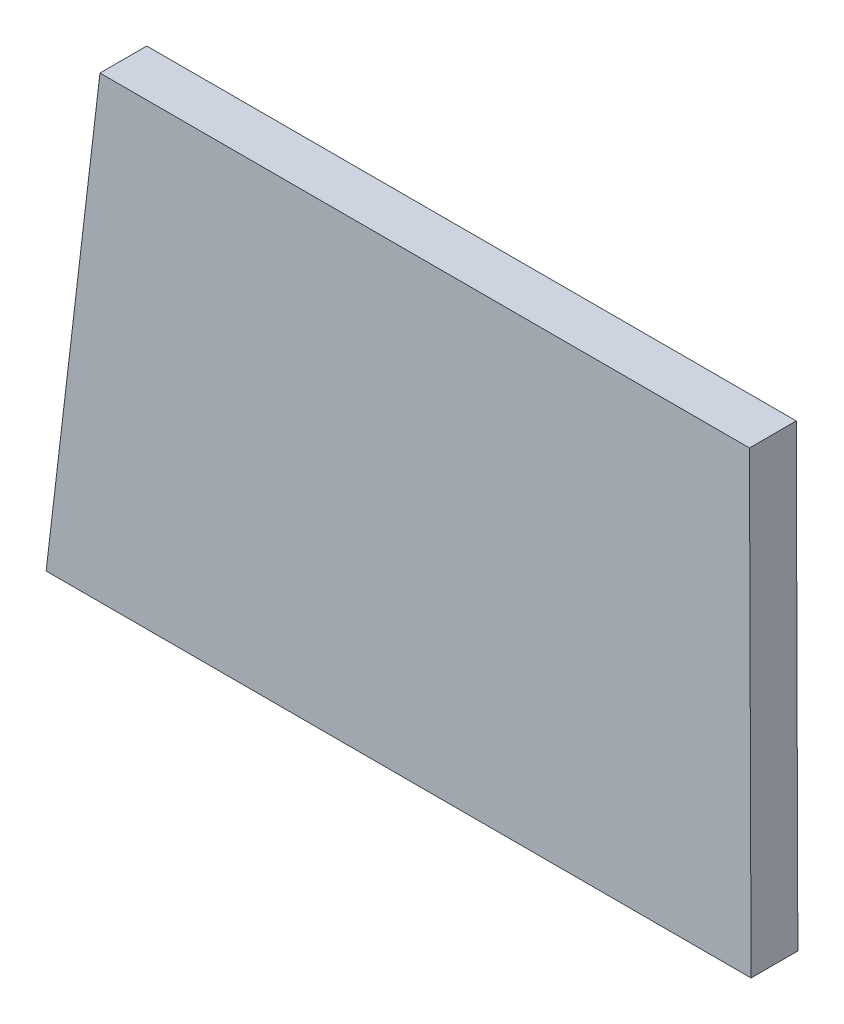
ISO-10303-21;
HEADER;
FILE_DESCRIPTION(('STEP AP214'),'2;1');
FILE_NAME('part.step','',(''),(''),'','','');
FILE_SCHEMA(('AUTOMOTIVE_DESIGN { 1 0 10303 214 1 1 1 1 }'));
ENDSEC;
DATA;
#1=APPLICATION_CONTEXT('core data for automotive mechanical design processes');
#2=APPLICATION_PROTOCOL_DEFINITION('international standard','automotive_design',2000,#1);
#3=PRODUCT_CONTEXT('',#1,'mechanical');
#4=PRODUCT('Part','Part','',(#3));
#5=PRODUCT_RELATED_PRODUCT_CATEGORY('part','',(#4));
#6=PRODUCT_DEFINITION_FORMATION('','',#4);
#7=PRODUCT_DEFINITION_CONTEXT('part definition',#1,'design');
#8=PRODUCT_DEFINITION('design','',#6,#7);
#9=PRODUCT_DEFINITION_SHAPE('','',#8);
#10=(LENGTH_UNIT() NAMED_UNIT(*) SI_UNIT(.MILLI.,.METRE.));
#11=(NAMED_UNIT(*) PLANE_ANGLE_UNIT() SI_UNIT($,.RADIAN.));
#12=(NAMED_UNIT(*) SI_UNIT($,.STERADIAN.) SOLID_ANGLE_UNIT());
#13=UNCERTAINTY_MEASURE_WITH_UNIT(LENGTH_MEASURE(1.E-05),#10,'distance_accuracy_value','');
#14=(GEOMETRIC_REPRESENTATION_CONTEXT(3) GLOBAL_UNCERTAINTY_ASSIGNED_CONTEXT((#13)) GLOBAL_UNIT_ASSIGNED_CONTEXT((#10,
#11,#12)) REPRESENTATION_CONTEXT('',''));
#15=CARTESIAN_POINT('',(0.,0.,0.));
#16=DIRECTION('',(0.,0.,1.));
#17=DIRECTION('',(1.,0.,0.));
#18=AXIS2_PLACEMENT_3D('',#15,#16,#17);
#19=CARTESIAN_POINT('',(30.125,0.,2.));
#20=DIRECTION('',(0.,1.,0.));
#21=DIRECTION('',(-1.,0.,0.));
#22=AXIS2_PLACEMENT_3D('',#19,#20,#21);
#23=PLANE('',#22);
#24=DIRECTION('',(1.,0.,0.));
#25=VECTOR('',#24,1.);
#26=CARTESIAN_POINT('',(30.125,0.,0.));
#27=LINE('',#26,#25);
#28=CARTESIAN_POINT('',(0.,0.,0.));
#29=VERTEX_POINT('',#28);
#30=CARTESIAN_POINT('',(30.125,0.,0.));
#31=VERTEX_POINT('',#30);
#32=EDGE_CURVE('E96',#29,#31,#27,.T.);
#33=ORIENTED_EDGE('',*,*,#32,.T.);
#34=DIRECTION('',(0.,0.,-1.));
#35=VECTOR('',#34,1.);
#36=CARTESIAN_POINT('',(30.125,0.,2.));
#37=LINE('',#36,#35);
#38=CARTESIAN_POINT('',(30.125,0.,2.));
#39=VERTEX_POINT('',#38);
#40=EDGE_CURVE('E11',#39,#31,#37,.T.);
#41=ORIENTED_EDGE('',*,*,#40,.F.);
#42=DIRECTION('',(1.,0.,0.));
#43=VECTOR('',#42,1.);
#44=CARTESIAN_POINT('',(30.125,0.,2.));
#45=LINE('',#44,#43);
#46=CARTESIAN_POINT('',(0.,0.,2.));
#47=VERTEX_POINT('',#46);
#48=EDGE_CURVE('E84',#47,#39,#45,.T.);
#49=ORIENTED_EDGE('',*,*,#48,.F.);
#50=DIRECTION('',(0.,0.,-1.));
#51=VECTOR('',#50,1.);
#52=CARTESIAN_POINT('',(0.,0.,2.));
#53=LINE('',#52,#51);
#54=EDGE_CURVE('E92',#47,#29,#53,.T.);
#55=ORIENTED_EDGE('',*,*,#54,.T.);
#56=EDGE_LOOP('',(#33,#41,#49,#55));
#57=FACE_BOUND('',#56,.T.);
#58=ADVANCED_FACE('F33',(#57),#23,.F.);
#59=CARTESIAN_POINT('',(30.0566425733356,19.5828806936625,2.));
#60=DIRECTION('',(-0.99999390765779,-0.00349065141522731,0.));
#61=DIRECTION('',(0.00349065141522731,-0.999993907657791,0.));
#62=AXIS2_PLACEMENT_3D('',#59,#60,#61);
#63=PLANE('',#62);
#64=DIRECTION('',(-0.00349065141522731,0.999993907657791,0.));
#65=VECTOR('',#64,1.);
#66=CARTESIAN_POINT('',(30.0566425733356,19.5828806936625,0.));
#67=LINE('',#66,#65);
#68=CARTESIAN_POINT('',(30.0566425733356,19.5828806936625,0.));
#69=VERTEX_POINT('',#68);
#70=EDGE_CURVE('E88',#31,#69,#67,.T.);
#71=ORIENTED_EDGE('',*,*,#70,.T.);
#72=DIRECTION('',(0.,0.,-1.));
#73=VECTOR('',#72,1.);
#74=CARTESIAN_POINT('',(30.0566425733356,19.5828806936625,2.));
#75=LINE('',#74,#73);
#76=CARTESIAN_POINT('',(30.0566425733356,19.5828806936625,2.));
#77=VERTEX_POINT('',#76);
#78=EDGE_CURVE('E41',#77,#69,#75,.T.);
#79=ORIENTED_EDGE('',*,*,#78,.F.);
#80=DIRECTION('',(-0.00349065141522731,0.999993907657791,0.));
#81=VECTOR('',#80,1.);
#82=CARTESIAN_POINT('',(30.0566425733356,19.5828806936625,2.));
#83=LINE('',#82,#81);
#84=EDGE_CURVE('E79',#39,#77,#83,.T.);
#85=ORIENTED_EDGE('',*,*,#84,.F.);
#86=ORIENTED_EDGE('',*,*,#40,.T.);
#87=EDGE_LOOP('',(#71,#79,#85,#86));
#88=FACE_BOUND('',#87,.T.);
#89=ADVANCED_FACE('F87',(#88),#63,.F.);
#90=CARTESIAN_POINT('',(2.30016358191342,19.5803593556512,2.));
#91=DIRECTION('',(9.08378185014016E-05,-0.999999995874245,0.));
#92=DIRECTION('',(0.999999995874245,9.08378185014016E-05,0.));
#93=AXIS2_PLACEMENT_3D('',#90,#91,#92);
#94=PLANE('',#93);
#95=DIRECTION('',(-0.999999995874245,-9.08378185014016E-05,0.));
#96=VECTOR('',#95,1.);
#97=CARTESIAN_POINT('',(2.30016358191342,19.5803593556512,0.));
#98=LINE('',#97,#96);
#99=CARTESIAN_POINT('',(2.30016358191342,19.5803593556512,0.));
#100=VERTEX_POINT('',#99);
#101=EDGE_CURVE('E66',#69,#100,#98,.T.);
#102=ORIENTED_EDGE('',*,*,#101,.T.);
#103=DIRECTION('',(0.,0.,-1.));
#104=VECTOR('',#103,1.);
#105=CARTESIAN_POINT('',(2.30016358191342,19.5803593556512,2.));
#106=LINE('',#105,#104);
#107=CARTESIAN_POINT('',(2.30016358191342,19.5803593556512,2.));
#108=VERTEX_POINT('',#107);
#109=EDGE_CURVE('E89',#108,#100,#106,.T.);
#110=ORIENTED_EDGE('',*,*,#109,.F.);
#111=DIRECTION('',(-0.999999995874245,-9.08378185014016E-05,0.));
#112=VECTOR('',#111,1.);
#113=CARTESIAN_POINT('',(2.30016358191342,19.5803593556512,2.));
#114=LINE('',#113,#112);
#115=EDGE_CURVE('E82',#77,#108,#114,.T.);
#116=ORIENTED_EDGE('',*,*,#115,.F.);
#117=ORIENTED_EDGE('',*,*,#78,.T.);
#118=EDGE_LOOP('',(#102,#110,#116,#117));
#119=FACE_BOUND('',#118,.T.);
#120=ADVANCED_FACE('F90',(#119),#94,.F.);
#121=CARTESIAN_POINT('',(0.,0.,2.));
#122=DIRECTION('',(0.993170649538486,-0.116670737099337,0.));
#123=DIRECTION('',(0.116670737099337,0.993170649538486,0.));
#124=AXIS2_PLACEMENT_3D('',#121,#122,#123);
#125=PLANE('',#124);
#126=DIRECTION('',(-0.116670737099337,-0.993170649538486,0.));
#127=VECTOR('',#126,1.);
#128=CARTESIAN_POINT('',(0.,0.,0.));
#129=LINE('',#128,#127);
#130=EDGE_CURVE('E72',#100,#29,#129,.T.);
#131=ORIENTED_EDGE('',*,*,#130,.T.);
#132=ORIENTED_EDGE('',*,*,#54,.F.);
#133=DIRECTION('',(-0.116670737099337,-0.993170649538486,0.));
#134=VECTOR('',#133,1.);
#135=CARTESIAN_POINT('',(0.,0.,2.));
#136=LINE('',#135,#134);
#137=EDGE_CURVE('E49',#108,#47,#136,.T.);
#138=ORIENTED_EDGE('',*,*,#137,.F.);
#139=ORIENTED_EDGE('',*,*,#109,.T.);
#140=EDGE_LOOP('',(#131,#132,#138,#139));
#141=FACE_BOUND('',#140,.T.);
#142=ADVANCED_FACE('F103',(#141),#125,.F.);
#143=CARTESIAN_POINT('',(0.,0.,2.));
#144=DIRECTION('',(0.,0.,1.));
#145=DIRECTION('',(1.,0.,0.));
#146=AXIS2_PLACEMENT_3D('',#143,#144,#145);
#147=PLANE('',#146);
#148=ORIENTED_EDGE('',*,*,#48,.T.);
#149=ORIENTED_EDGE('',*,*,#84,.T.);
#150=ORIENTED_EDGE('',*,*,#115,.T.);
#151=ORIENTED_EDGE('',*,*,#137,.T.);
#152=EDGE_LOOP('',(#148,#149,#150,#151));
#153=FACE_BOUND('',#152,.T.);
#154=ADVANCED_FACE('F80',(#153),#147,.T.);
#155=CARTESIAN_POINT('',(0.,0.,0.));
#156=DIRECTION('',(0.,0.,1.));
#157=DIRECTION('',(1.,0.,0.));
#158=AXIS2_PLACEMENT_3D('',#155,#156,#157);
#159=PLANE('',#158);
#160=ORIENTED_EDGE('',*,*,#32,.F.);
#161=ORIENTED_EDGE('',*,*,#130,.F.);
#162=ORIENTED_EDGE('',*,*,#101,.F.);
#163=ORIENTED_EDGE('',*,*,#70,.F.);
#164=EDGE_LOOP('',(#160,#161,#162,#163));
#165=FACE_BOUND('',#164,.T.);
#166=ADVANCED_FACE('F106',(#165),#159,.F.);
#167=CLOSED_SHELL('',(#58,#89,#120,#142,#154,#166));
#168=MANIFOLD_SOLID_BREP('B2',#167);
#169=ADVANCED_BREP_SHAPE_REPRESENTATION('',(#18,#168),#14);
#170=SHAPE_DEFINITION_REPRESENTATION(#9,#169);
ENDSEC;
END-ISO-10303-21;
